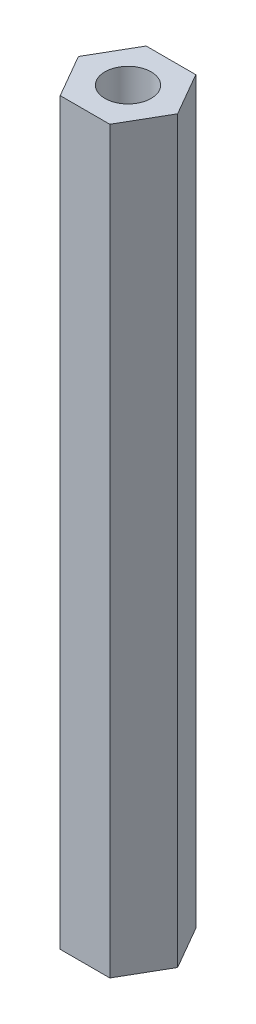
ISO-10303-21;
HEADER;
FILE_DESCRIPTION(('STEP AP214'),'2;1');
FILE_NAME('part.step','',(''),(''),'','','');
FILE_SCHEMA(('AUTOMOTIVE_DESIGN { 1 0 10303 214 1 1 1 1 }'));
ENDSEC;
DATA;
#1=APPLICATION_CONTEXT('core data for automotive mechanical design processes');
#2=APPLICATION_PROTOCOL_DEFINITION('international standard','automotive_design',2000,#1);
#3=PRODUCT_CONTEXT('',#1,'mechanical');
#4=PRODUCT('Part','Part','',(#3));
#5=PRODUCT_RELATED_PRODUCT_CATEGORY('part','',(#4));
#6=PRODUCT_DEFINITION_FORMATION('','',#4);
#7=PRODUCT_DEFINITION_CONTEXT('part definition',#1,'design');
#8=PRODUCT_DEFINITION('design','',#6,#7);
#9=PRODUCT_DEFINITION_SHAPE('','',#8);
#10=(LENGTH_UNIT() NAMED_UNIT(*) SI_UNIT(.MILLI.,.METRE.));
#11=(NAMED_UNIT(*) PLANE_ANGLE_UNIT() SI_UNIT($,.RADIAN.));
#12=(NAMED_UNIT(*) SI_UNIT($,.STERADIAN.) SOLID_ANGLE_UNIT());
#13=UNCERTAINTY_MEASURE_WITH_UNIT(LENGTH_MEASURE(1.E-05),#10,'distance_accuracy_value','');
#14=(GEOMETRIC_REPRESENTATION_CONTEXT(3) GLOBAL_UNCERTAINTY_ASSIGNED_CONTEXT((#13)) GLOBAL_UNIT_ASSIGNED_CONTEXT((#10,
#11,#12)) REPRESENTATION_CONTEXT('',''));
#15=CARTESIAN_POINT('',(0.,0.,0.));
#16=DIRECTION('',(0.,0.,1.));
#17=DIRECTION('',(1.,0.,0.));
#18=AXIS2_PLACEMENT_3D('',#15,#16,#17);
#19=CARTESIAN_POINT('',(1.34233937586591,20.,2.32499999999999));
#20=DIRECTION('',(-0.866025403784442,0.,-0.499999999999995));
#21=DIRECTION('',(-0.499999999999995,0.,0.866025403784442));
#22=AXIS2_PLACEMENT_3D('',#19,#20,#21);
#23=PLANE('',#22);
#24=DIRECTION('',(0.499999999999995,0.,-0.866025403784442));
#25=VECTOR('',#24,1.);
#26=CARTESIAN_POINT('',(1.34233937586591,-20.,2.32499999999999));
#27=LINE('',#26,#25);
#28=CARTESIAN_POINT('',(1.34233937586591,-20.,2.32499999999999));
#29=VERTEX_POINT('',#28);
#30=CARTESIAN_POINT('',(2.68467875173176,-20.,0.));
#31=VERTEX_POINT('',#30);
#32=EDGE_CURVE('E127',#29,#31,#27,.T.);
#33=ORIENTED_EDGE('',*,*,#32,.T.);
#34=DIRECTION('',(0.,-1.,0.));
#35=VECTOR('',#34,1.);
#36=CARTESIAN_POINT('',(2.68467875173176,20.,0.));
#37=LINE('',#36,#35);
#38=CARTESIAN_POINT('',(2.68467875173176,20.,0.));
#39=VERTEX_POINT('',#38);
#40=EDGE_CURVE('E11',#39,#31,#37,.T.);
#41=ORIENTED_EDGE('',*,*,#40,.F.);
#42=DIRECTION('',(0.499999999999995,0.,-0.866025403784442));
#43=VECTOR('',#42,1.);
#44=CARTESIAN_POINT('',(1.34233937586591,20.,2.32499999999999));
#45=LINE('',#44,#43);
#46=CARTESIAN_POINT('',(1.34233937586591,20.,2.32499999999999));
#47=VERTEX_POINT('',#46);
#48=EDGE_CURVE('E138',#47,#39,#45,.T.);
#49=ORIENTED_EDGE('',*,*,#48,.F.);
#50=DIRECTION('',(0.,-1.,0.));
#51=VECTOR('',#50,1.);
#52=CARTESIAN_POINT('',(1.34233937586591,20.,2.32499999999999));
#53=LINE('',#52,#51);
#54=EDGE_CURVE('E123',#47,#29,#53,.T.);
#55=ORIENTED_EDGE('',*,*,#54,.T.);
#56=EDGE_LOOP('',(#33,#41,#49,#55));
#57=FACE_BOUND('',#56,.T.);
#58=ADVANCED_FACE('F40',(#57),#23,.F.);
#59=CARTESIAN_POINT('',(2.68467875173176,20.,0.));
#60=DIRECTION('',(-0.866025403784438,0.,0.500000000000001));
#61=DIRECTION('',(0.500000000000001,0.,0.866025403784438));
#62=AXIS2_PLACEMENT_3D('',#59,#60,#61);
#63=PLANE('',#62);
#64=DIRECTION('',(-0.500000000000001,0.,-0.866025403784438));
#65=VECTOR('',#64,1.);
#66=CARTESIAN_POINT('',(2.68467875173176,-20.,0.));
#67=LINE('',#66,#65);
#68=CARTESIAN_POINT('',(1.34233937586588,-20.,-2.325));
#69=VERTEX_POINT('',#68);
#70=EDGE_CURVE('E130',#31,#69,#67,.T.);
#71=ORIENTED_EDGE('',*,*,#70,.T.);
#72=DIRECTION('',(0.,-1.,0.));
#73=VECTOR('',#72,1.);
#74=CARTESIAN_POINT('',(1.34233937586588,20.,-2.325));
#75=LINE('',#74,#73);
#76=CARTESIAN_POINT('',(1.34233937586588,20.,-2.325));
#77=VERTEX_POINT('',#76);
#78=EDGE_CURVE('E48',#77,#69,#75,.T.);
#79=ORIENTED_EDGE('',*,*,#78,.F.);
#80=DIRECTION('',(-0.500000000000001,0.,-0.866025403784438));
#81=VECTOR('',#80,1.);
#82=CARTESIAN_POINT('',(2.68467875173176,20.,0.));
#83=LINE('',#82,#81);
#84=EDGE_CURVE('E94',#39,#77,#83,.T.);
#85=ORIENTED_EDGE('',*,*,#84,.F.);
#86=ORIENTED_EDGE('',*,*,#40,.T.);
#87=EDGE_LOOP('',(#71,#79,#85,#86));
#88=FACE_BOUND('',#87,.T.);
#89=ADVANCED_FACE('F163',(#88),#63,.F.);
#90=CARTESIAN_POINT('',(1.34233937586588,20.,-2.325));
#91=DIRECTION('',(0.,0.,1.));
#92=DIRECTION('',(1.,0.,0.));
#93=AXIS2_PLACEMENT_3D('',#90,#91,#92);
#94=PLANE('',#93);
#95=DIRECTION('',(-1.,0.,0.));
#96=VECTOR('',#95,1.);
#97=CARTESIAN_POINT('',(1.34233937586588,-20.,-2.325));
#98=LINE('',#97,#96);
#99=CARTESIAN_POINT('',(-1.34233937586589,-20.,-2.32499999999999));
#100=VERTEX_POINT('',#99);
#101=EDGE_CURVE('E133',#69,#100,#98,.T.);
#102=ORIENTED_EDGE('',*,*,#101,.T.);
#103=DIRECTION('',(0.,-1.,0.));
#104=VECTOR('',#103,1.);
#105=CARTESIAN_POINT('',(-1.34233937586589,20.,-2.32499999999999));
#106=LINE('',#105,#104);
#107=CARTESIAN_POINT('',(-1.34233937586589,20.,-2.32499999999999));
#108=VERTEX_POINT('',#107);
#109=EDGE_CURVE('E118',#108,#100,#106,.T.);
#110=ORIENTED_EDGE('',*,*,#109,.F.);
#111=DIRECTION('',(-1.,0.,0.));
#112=VECTOR('',#111,1.);
#113=CARTESIAN_POINT('',(1.34233937586588,20.,-2.325));
#114=LINE('',#113,#112);
#115=EDGE_CURVE('E109',#77,#108,#114,.T.);
#116=ORIENTED_EDGE('',*,*,#115,.F.);
#117=ORIENTED_EDGE('',*,*,#78,.T.);
#118=EDGE_LOOP('',(#102,#110,#116,#117));
#119=FACE_BOUND('',#118,.T.);
#120=ADVANCED_FACE('F144',(#119),#94,.F.);
#121=CARTESIAN_POINT('',(-1.34233937586589,20.,-2.32499999999999));
#122=DIRECTION('',(0.866025403784441,0.,0.499999999999995));
#123=DIRECTION('',(0.499999999999995,0.,-0.866025403784441));
#124=AXIS2_PLACEMENT_3D('',#121,#122,#123);
#125=PLANE('',#124);
#126=DIRECTION('',(-0.499999999999995,0.,0.866025403784441));
#127=VECTOR('',#126,1.);
#128=CARTESIAN_POINT('',(-1.34233937586589,-20.,-2.32499999999999));
#129=LINE('',#128,#127);
#130=CARTESIAN_POINT('',(-2.68467875173176,-20.,0.));
#131=VERTEX_POINT('',#130);
#132=EDGE_CURVE('E117',#100,#131,#129,.T.);
#133=ORIENTED_EDGE('',*,*,#132,.T.);
#134=DIRECTION('',(0.,-1.,0.));
#135=VECTOR('',#134,1.);
#136=CARTESIAN_POINT('',(-2.68467875173176,20.,0.));
#137=LINE('',#136,#135);
#138=CARTESIAN_POINT('',(-2.68467875173176,20.,0.));
#139=VERTEX_POINT('',#138);
#140=EDGE_CURVE('E114',#139,#131,#137,.T.);
#141=ORIENTED_EDGE('',*,*,#140,.F.);
#142=DIRECTION('',(-0.499999999999995,0.,0.866025403784441));
#143=VECTOR('',#142,1.);
#144=CARTESIAN_POINT('',(-1.34233937586589,20.,-2.32499999999999));
#145=LINE('',#144,#143);
#146=EDGE_CURVE('E103',#108,#139,#145,.T.);
#147=ORIENTED_EDGE('',*,*,#146,.F.);
#148=ORIENTED_EDGE('',*,*,#109,.T.);
#149=EDGE_LOOP('',(#133,#141,#147,#148));
#150=FACE_BOUND('',#149,.T.);
#151=ADVANCED_FACE('F115',(#150),#125,.F.);
#152=CARTESIAN_POINT('',(-2.68467875173176,20.,0.));
#153=DIRECTION('',(0.866025403784434,0.,-0.500000000000007));
#154=DIRECTION('',(-0.500000000000007,0.,-0.866025403784435));
#155=AXIS2_PLACEMENT_3D('',#152,#153,#154);
#156=PLANE('',#155);
#157=DIRECTION('',(0.500000000000007,0.,0.866025403784434));
#158=VECTOR('',#157,1.);
#159=CARTESIAN_POINT('',(-2.68467875173176,-20.,0.));
#160=LINE('',#159,#158);
#161=CARTESIAN_POINT('',(-1.34233937586586,-20.,2.32500000000001));
#162=VERTEX_POINT('',#161);
#163=EDGE_CURVE('E80',#131,#162,#160,.T.);
#164=ORIENTED_EDGE('',*,*,#163,.T.);
#165=DIRECTION('',(0.,-1.,0.));
#166=VECTOR('',#165,1.);
#167=CARTESIAN_POINT('',(-1.34233937586586,20.,2.32500000000001));
#168=LINE('',#167,#166);
#169=CARTESIAN_POINT('',(-1.34233937586586,20.,2.32500000000001));
#170=VERTEX_POINT('',#169);
#171=EDGE_CURVE('E119',#170,#162,#168,.T.);
#172=ORIENTED_EDGE('',*,*,#171,.F.);
#173=DIRECTION('',(0.500000000000007,0.,0.866025403784434));
#174=VECTOR('',#173,1.);
#175=CARTESIAN_POINT('',(-2.68467875173176,20.,0.));
#176=LINE('',#175,#174);
#177=EDGE_CURVE('E107',#139,#170,#176,.T.);
#178=ORIENTED_EDGE('',*,*,#177,.F.);
#179=ORIENTED_EDGE('',*,*,#140,.T.);
#180=EDGE_LOOP('',(#164,#172,#178,#179));
#181=FACE_BOUND('',#180,.T.);
#182=ADVANCED_FACE('F121',(#181),#156,.F.);
#183=CARTESIAN_POINT('',(-1.34233937586586,20.,2.32500000000001));
#184=DIRECTION('',(0.,0.,-1.));
#185=DIRECTION('',(-1.,0.,0.));
#186=AXIS2_PLACEMENT_3D('',#183,#184,#185);
#187=PLANE('',#186);
#188=DIRECTION('',(1.,0.,0.));
#189=VECTOR('',#188,1.);
#190=CARTESIAN_POINT('',(-1.34233937586586,-20.,2.32500000000001));
#191=LINE('',#190,#189);
#192=EDGE_CURVE('E86',#162,#29,#191,.T.);
#193=ORIENTED_EDGE('',*,*,#192,.T.);
#194=ORIENTED_EDGE('',*,*,#54,.F.);
#195=DIRECTION('',(1.,0.,0.));
#196=VECTOR('',#195,1.);
#197=CARTESIAN_POINT('',(-1.34233937586586,20.,2.32500000000001));
#198=LINE('',#197,#196);
#199=EDGE_CURVE('E56',#170,#47,#198,.T.);
#200=ORIENTED_EDGE('',*,*,#199,.F.);
#201=ORIENTED_EDGE('',*,*,#171,.T.);
#202=EDGE_LOOP('',(#193,#194,#200,#201));
#203=FACE_BOUND('',#202,.T.);
#204=ADVANCED_FACE('F151',(#203),#187,.F.);
#205=CARTESIAN_POINT('',(0.,20.,0.));
#206=DIRECTION('',(0.,1.,0.));
#207=DIRECTION('',(0.,0.,1.));
#208=AXIS2_PLACEMENT_3D('',#205,#206,#207);
#209=PLANE('',#208);
#210=CARTESIAN_POINT('',(0.,20.,0.));
#211=DIRECTION('',(0.,1.,0.));
#212=DIRECTION('',(0.,0.,1.));
#213=AXIS2_PLACEMENT_3D('',#210,#211,#212);
#214=CIRCLE('',#213,1.24999999999999);
#215=CARTESIAN_POINT('',(0.,20.,1.24999999999999));
#216=VERTEX_POINT('',#215);
#217=EDGE_CURVE('E257',#216,#216,#214,.T.);
#218=ORIENTED_EDGE('',*,*,#217,.F.);
#219=EDGE_LOOP('',(#218));
#220=FACE_BOUND('',#219,.T.);
#221=ORIENTED_EDGE('',*,*,#48,.T.);
#222=ORIENTED_EDGE('',*,*,#84,.T.);
#223=ORIENTED_EDGE('',*,*,#115,.T.);
#224=ORIENTED_EDGE('',*,*,#146,.T.);
#225=ORIENTED_EDGE('',*,*,#177,.T.);
#226=ORIENTED_EDGE('',*,*,#199,.T.);
#227=EDGE_LOOP('',(#221,#222,#223,#224,#225,#226));
#228=FACE_BOUND('',#227,.T.);
#229=ADVANCED_FACE('F105',(#220,#228),#209,.T.);
#230=CARTESIAN_POINT('',(0.,-20.,0.));
#231=DIRECTION('',(0.,1.,0.));
#232=DIRECTION('',(0.,0.,1.));
#233=AXIS2_PLACEMENT_3D('',#230,#231,#232);
#234=PLANE('',#233);
#235=CARTESIAN_POINT('',(0.,-20.,0.));
#236=DIRECTION('',(0.,-1.,0.));
#237=DIRECTION('',(0.,0.,-1.));
#238=AXIS2_PLACEMENT_3D('',#235,#236,#237);
#239=CIRCLE('',#238,1.24999999999999);
#240=CARTESIAN_POINT('',(0.,-20.,-1.24999999999999));
#241=VERTEX_POINT('',#240);
#242=EDGE_CURVE('E259',#241,#241,#239,.T.);
#243=ORIENTED_EDGE('',*,*,#242,.F.);
#244=EDGE_LOOP('',(#243));
#245=FACE_BOUND('',#244,.T.);
#246=ORIENTED_EDGE('',*,*,#32,.F.);
#247=ORIENTED_EDGE('',*,*,#192,.F.);
#248=ORIENTED_EDGE('',*,*,#163,.F.);
#249=ORIENTED_EDGE('',*,*,#132,.F.);
#250=ORIENTED_EDGE('',*,*,#101,.F.);
#251=ORIENTED_EDGE('',*,*,#70,.F.);
#252=EDGE_LOOP('',(#246,#247,#248,#249,#250,#251));
#253=FACE_BOUND('',#252,.T.);
#254=ADVANCED_FACE('F147',(#245,#253),#234,.F.);
#255=CARTESIAN_POINT('',(0.,-12.5,0.));
#256=DIRECTION('',(0.,-1.,0.));
#257=DIRECTION('',(0.,0.,-1.));
#258=AXIS2_PLACEMENT_3D('',#255,#256,#257);
#259=CONICAL_SURFACE('',#258,1.25,1.02974425867665);
#260=CARTESIAN_POINT('',(0.,-11.7489242262155,0.));
#261=VERTEX_POINT('',#260);
#262=VERTEX_LOOP('',#261);
#263=FACE_BOUND('',#262,.T.);
#264=CARTESIAN_POINT('',(0.,-12.5,0.));
#265=DIRECTION('',(0.,-1.,0.));
#266=DIRECTION('',(0.,0.,-1.));
#267=AXIS2_PLACEMENT_3D('',#264,#265,#266);
#268=CIRCLE('',#267,1.25);
#269=CARTESIAN_POINT('',(0.,-12.5,-1.25));
#270=VERTEX_POINT('',#269);
#271=EDGE_CURVE('E131',#270,#270,#268,.T.);
#272=ORIENTED_EDGE('',*,*,#271,.T.);
#273=EDGE_LOOP('',(#272));
#274=FACE_BOUND('',#273,.T.);
#275=ADVANCED_FACE('F195',(#263,#274),#259,.F.);
#276=CARTESIAN_POINT('',(0.,-20.,0.));
#277=DIRECTION('',(0.,-1.,0.));
#278=DIRECTION('',(0.,0.,-1.));
#279=AXIS2_PLACEMENT_3D('',#276,#277,#278);
#280=CYLINDRICAL_SURFACE('',#279,1.24999999999999);
#281=ORIENTED_EDGE('',*,*,#271,.F.);
#282=EDGE_LOOP('',(#281));
#283=FACE_BOUND('',#282,.T.);
#284=ORIENTED_EDGE('',*,*,#242,.T.);
#285=EDGE_LOOP('',(#284));
#286=FACE_BOUND('',#285,.T.);
#287=ADVANCED_FACE('F204',(#283,#286),#280,.F.);
#288=CARTESIAN_POINT('',(0.,12.5,0.));
#289=DIRECTION('',(0.,1.,0.));
#290=DIRECTION('',(0.,0.,1.));
#291=AXIS2_PLACEMENT_3D('',#288,#289,#290);
#292=CONICAL_SURFACE('',#291,1.25,1.02974425867665);
#293=CARTESIAN_POINT('',(0.,11.7489242262155,0.));
#294=VERTEX_POINT('',#293);
#295=VERTEX_LOOP('',#294);
#296=FACE_BOUND('',#295,.T.);
#297=CARTESIAN_POINT('',(0.,12.5,0.));
#298=DIRECTION('',(0.,1.,0.));
#299=DIRECTION('',(0.,0.,1.));
#300=AXIS2_PLACEMENT_3D('',#297,#298,#299);
#301=CIRCLE('',#300,1.25);
#302=CARTESIAN_POINT('',(0.,12.5,1.25));
#303=VERTEX_POINT('',#302);
#304=EDGE_CURVE('E254',#303,#303,#301,.T.);
#305=ORIENTED_EDGE('',*,*,#304,.T.);
#306=EDGE_LOOP('',(#305));
#307=FACE_BOUND('',#306,.T.);
#308=ADVANCED_FACE('F215',(#296,#307),#292,.F.);
#309=CARTESIAN_POINT('',(0.,20.,0.));
#310=DIRECTION('',(0.,1.,0.));
#311=DIRECTION('',(0.,0.,1.));
#312=AXIS2_PLACEMENT_3D('',#309,#310,#311);
#313=CYLINDRICAL_SURFACE('',#312,1.24999999999999);
#314=ORIENTED_EDGE('',*,*,#304,.F.);
#315=EDGE_LOOP('',(#314));
#316=FACE_BOUND('',#315,.T.);
#317=ORIENTED_EDGE('',*,*,#217,.T.);
#318=EDGE_LOOP('',(#317));
#319=FACE_BOUND('',#318,.T.);
#320=ADVANCED_FACE('F232',(#316,#319),#313,.F.);
#321=CLOSED_SHELL('',(#58,#89,#120,#151,#182,#204,#229,#254,#275,#287,#308,#320));
#322=MANIFOLD_SOLID_BREP('B2',#321);
#323=ADVANCED_BREP_SHAPE_REPRESENTATION('',(#18,#322),#14);
#324=SHAPE_DEFINITION_REPRESENTATION(#9,#323);
ENDSEC;
END-ISO-10303-21;
